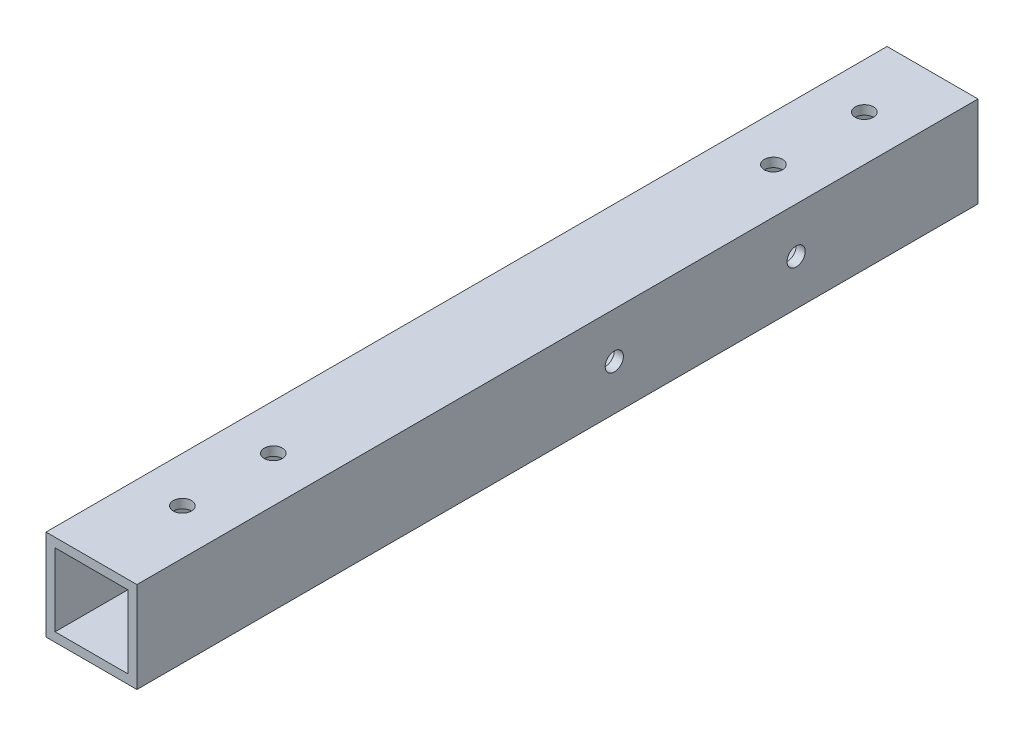
ISO-10303-21;
HEADER;
FILE_DESCRIPTION(('STEP AP214'),'2;1');
FILE_NAME('part.step','',(''),(''),'','','');
FILE_SCHEMA(('AUTOMOTIVE_DESIGN { 1 0 10303 214 1 1 1 1 }'));
ENDSEC;
DATA;
#1=APPLICATION_CONTEXT('core data for automotive mechanical design processes');
#2=APPLICATION_PROTOCOL_DEFINITION('international standard','automotive_design',2000,#1);
#3=PRODUCT_CONTEXT('',#1,'mechanical');
#4=PRODUCT('Part','Part','',(#3));
#5=PRODUCT_RELATED_PRODUCT_CATEGORY('part','',(#4));
#6=PRODUCT_DEFINITION_FORMATION('','',#4);
#7=PRODUCT_DEFINITION_CONTEXT('part definition',#1,'design');
#8=PRODUCT_DEFINITION('design','',#6,#7);
#9=PRODUCT_DEFINITION_SHAPE('','',#8);
#10=(LENGTH_UNIT() NAMED_UNIT(*) SI_UNIT(.MILLI.,.METRE.));
#11=(NAMED_UNIT(*) PLANE_ANGLE_UNIT() SI_UNIT($,.RADIAN.));
#12=(NAMED_UNIT(*) SI_UNIT($,.STERADIAN.) SOLID_ANGLE_UNIT());
#13=UNCERTAINTY_MEASURE_WITH_UNIT(LENGTH_MEASURE(1.E-05),#10,'distance_accuracy_value','');
#14=(GEOMETRIC_REPRESENTATION_CONTEXT(3) GLOBAL_UNCERTAINTY_ASSIGNED_CONTEXT((#13)) GLOBAL_UNIT_ASSIGNED_CONTEXT((#10,
#11,#12)) REPRESENTATION_CONTEXT('',''));
#15=CARTESIAN_POINT('',(0.,0.,0.));
#16=DIRECTION('',(0.,0.,1.));
#17=DIRECTION('',(1.,0.,0.));
#18=AXIS2_PLACEMENT_3D('',#15,#16,#17);
#19=CARTESIAN_POINT('',(0.,0.,185.));
#20=DIRECTION('',(0.,0.,-1.));
#21=DIRECTION('',(-1.,0.,0.));
#22=AXIS2_PLACEMENT_3D('',#19,#20,#21);
#23=PLANE('',#22);
#24=DIRECTION('',(0.,1.,0.));
#25=VECTOR('',#24,1.);
#26=CARTESIAN_POINT('',(10.,-10.,185.));
#27=LINE('',#26,#25);
#28=CARTESIAN_POINT('',(10.,-10.,185.));
#29=VERTEX_POINT('',#28);
#30=CARTESIAN_POINT('',(10.,10.,185.));
#31=VERTEX_POINT('',#30);
#32=EDGE_CURVE('E142',#29,#31,#27,.T.);
#33=ORIENTED_EDGE('',*,*,#32,.T.);
#34=DIRECTION('',(-1.,0.,0.));
#35=VECTOR('',#34,1.);
#36=CARTESIAN_POINT('',(-10.,10.,185.));
#37=LINE('',#36,#35);
#38=CARTESIAN_POINT('',(-10.,10.,185.));
#39=VERTEX_POINT('',#38);
#40=EDGE_CURVE('E145',#31,#39,#37,.T.);
#41=ORIENTED_EDGE('',*,*,#40,.T.);
#42=DIRECTION('',(0.,-1.,0.));
#43=VECTOR('',#42,1.);
#44=CARTESIAN_POINT('',(-10.,-10.,185.));
#45=LINE('',#44,#43);
#46=CARTESIAN_POINT('',(-10.,-10.,185.));
#47=VERTEX_POINT('',#46);
#48=EDGE_CURVE('E148',#39,#47,#45,.T.);
#49=ORIENTED_EDGE('',*,*,#48,.T.);
#50=DIRECTION('',(1.,0.,0.));
#51=VECTOR('',#50,1.);
#52=CARTESIAN_POINT('',(-10.,-10.,185.));
#53=LINE('',#52,#51);
#54=EDGE_CURVE('E150',#47,#29,#53,.T.);
#55=ORIENTED_EDGE('',*,*,#54,.T.);
#56=EDGE_LOOP('',(#33,#41,#49,#55));
#57=FACE_BOUND('',#56,.T.);
#58=DIRECTION('',(0.,1.,0.));
#59=VECTOR('',#58,1.);
#60=CARTESIAN_POINT('',(8.,7.99999999999999,185.));
#61=LINE('',#60,#59);
#62=CARTESIAN_POINT('',(8.,-8.00000000000001,185.));
#63=VERTEX_POINT('',#62);
#64=CARTESIAN_POINT('',(8.,7.99999999999999,185.));
#65=VERTEX_POINT('',#64);
#66=EDGE_CURVE('E104',#63,#65,#61,.T.);
#67=ORIENTED_EDGE('',*,*,#66,.F.);
#68=DIRECTION('',(1.,0.,0.));
#69=VECTOR('',#68,1.);
#70=CARTESIAN_POINT('',(-8.,-8.,185.));
#71=LINE('',#70,#69);
#72=CARTESIAN_POINT('',(-8.,-8.,185.));
#73=VERTEX_POINT('',#72);
#74=EDGE_CURVE('E126',#73,#63,#71,.T.);
#75=ORIENTED_EDGE('',*,*,#74,.F.);
#76=DIRECTION('',(0.,-1.,0.));
#77=VECTOR('',#76,1.);
#78=CARTESIAN_POINT('',(-8.,7.99999999999999,185.));
#79=LINE('',#78,#77);
#80=CARTESIAN_POINT('',(-8.,7.99999999999999,185.));
#81=VERTEX_POINT('',#80);
#82=EDGE_CURVE('E124',#81,#73,#79,.T.);
#83=ORIENTED_EDGE('',*,*,#82,.F.);
#84=DIRECTION('',(-1.,0.,0.));
#85=VECTOR('',#84,1.);
#86=CARTESIAN_POINT('',(-8.,7.99999999999999,185.));
#87=LINE('',#86,#85);
#88=EDGE_CURVE('E112',#65,#81,#87,.T.);
#89=ORIENTED_EDGE('',*,*,#88,.F.);
#90=EDGE_LOOP('',(#67,#75,#83,#89));
#91=FACE_BOUND('',#90,.T.);
#92=ADVANCED_FACE('F37',(#57,#91),#23,.F.);
#93=CARTESIAN_POINT('',(0.,0.,0.));
#94=DIRECTION('',(0.,0.,-1.));
#95=DIRECTION('',(-1.,0.,0.));
#96=AXIS2_PLACEMENT_3D('',#93,#94,#95);
#97=PLANE('',#96);
#98=DIRECTION('',(0.,1.,0.));
#99=VECTOR('',#98,1.);
#100=CARTESIAN_POINT('',(10.,-10.,0.));
#101=LINE('',#100,#99);
#102=CARTESIAN_POINT('',(10.,-10.,0.));
#103=VERTEX_POINT('',#102);
#104=CARTESIAN_POINT('',(10.,10.,0.));
#105=VERTEX_POINT('',#104);
#106=EDGE_CURVE('E120',#103,#105,#101,.T.);
#107=ORIENTED_EDGE('',*,*,#106,.F.);
#108=DIRECTION('',(1.,0.,0.));
#109=VECTOR('',#108,1.);
#110=CARTESIAN_POINT('',(-10.,-10.,0.));
#111=LINE('',#110,#109);
#112=CARTESIAN_POINT('',(-10.,-10.,0.));
#113=VERTEX_POINT('',#112);
#114=EDGE_CURVE('E146',#113,#103,#111,.T.);
#115=ORIENTED_EDGE('',*,*,#114,.F.);
#116=DIRECTION('',(0.,-1.,0.));
#117=VECTOR('',#116,1.);
#118=CARTESIAN_POINT('',(-10.,-10.,0.));
#119=LINE('',#118,#117);
#120=CARTESIAN_POINT('',(-10.,10.,0.));
#121=VERTEX_POINT('',#120);
#122=EDGE_CURVE('E157',#121,#113,#119,.T.);
#123=ORIENTED_EDGE('',*,*,#122,.F.);
#124=DIRECTION('',(-1.,0.,0.));
#125=VECTOR('',#124,1.);
#126=CARTESIAN_POINT('',(-10.,10.,0.));
#127=LINE('',#126,#125);
#128=EDGE_CURVE('E155',#105,#121,#127,.T.);
#129=ORIENTED_EDGE('',*,*,#128,.F.);
#130=EDGE_LOOP('',(#107,#115,#123,#129));
#131=FACE_BOUND('',#130,.T.);
#132=DIRECTION('',(1.,0.,0.));
#133=VECTOR('',#132,1.);
#134=CARTESIAN_POINT('',(-8.,-8.,0.));
#135=LINE('',#134,#133);
#136=CARTESIAN_POINT('',(-8.,-8.,0.));
#137=VERTEX_POINT('',#136);
#138=CARTESIAN_POINT('',(8.,-8.00000000000001,0.));
#139=VERTEX_POINT('',#138);
#140=EDGE_CURVE('E113',#137,#139,#135,.T.);
#141=ORIENTED_EDGE('',*,*,#140,.T.);
#142=DIRECTION('',(0.,1.,0.));
#143=VECTOR('',#142,1.);
#144=CARTESIAN_POINT('',(8.,7.99999999999999,0.));
#145=LINE('',#144,#143);
#146=CARTESIAN_POINT('',(8.,7.99999999999999,0.));
#147=VERTEX_POINT('',#146);
#148=EDGE_CURVE('E62',#139,#147,#145,.T.);
#149=ORIENTED_EDGE('',*,*,#148,.T.);
#150=DIRECTION('',(-1.,0.,0.));
#151=VECTOR('',#150,1.);
#152=CARTESIAN_POINT('',(-8.,7.99999999999999,0.));
#153=LINE('',#152,#151);
#154=CARTESIAN_POINT('',(-8.,7.99999999999999,0.));
#155=VERTEX_POINT('',#154);
#156=EDGE_CURVE('E119',#147,#155,#153,.T.);
#157=ORIENTED_EDGE('',*,*,#156,.T.);
#158=DIRECTION('',(0.,-1.,0.));
#159=VECTOR('',#158,1.);
#160=CARTESIAN_POINT('',(-8.,7.99999999999999,0.));
#161=LINE('',#160,#159);
#162=EDGE_CURVE('E134',#155,#137,#161,.T.);
#163=ORIENTED_EDGE('',*,*,#162,.T.);
#164=EDGE_LOOP('',(#141,#149,#157,#163));
#165=FACE_BOUND('',#164,.T.);
#166=ADVANCED_FACE('F274',(#131,#165),#97,.T.);
#167=CARTESIAN_POINT('',(10.,-10.,185.));
#168=DIRECTION('',(-1.,0.,0.));
#169=DIRECTION('',(0.,0.,1.));
#170=AXIS2_PLACEMENT_3D('',#167,#168,#169);
#171=PLANE('',#170);
#172=CARTESIAN_POINT('',(10.,0.,40.));
#173=DIRECTION('',(-1.,0.,0.));
#174=DIRECTION('',(0.,0.,1.));
#175=AXIS2_PLACEMENT_3D('',#172,#173,#174);
#176=CIRCLE('',#175,2.);
#177=CARTESIAN_POINT('',(10.,0.,42.));
#178=VERTEX_POINT('',#177);
#179=EDGE_CURVE('E185',#178,#178,#176,.T.);
#180=ORIENTED_EDGE('',*,*,#179,.T.);
#181=EDGE_LOOP('',(#180));
#182=FACE_BOUND('',#181,.T.);
#183=CARTESIAN_POINT('',(10.,0.,80.));
#184=DIRECTION('',(-1.,0.,0.));
#185=DIRECTION('',(0.,0.,1.));
#186=AXIS2_PLACEMENT_3D('',#183,#184,#185);
#187=CIRCLE('',#186,2.);
#188=CARTESIAN_POINT('',(10.,0.,82.));
#189=VERTEX_POINT('',#188);
#190=EDGE_CURVE('E201',#189,#189,#187,.T.);
#191=ORIENTED_EDGE('',*,*,#190,.T.);
#192=EDGE_LOOP('',(#191));
#193=FACE_BOUND('',#192,.T.);
#194=ORIENTED_EDGE('',*,*,#106,.T.);
#195=DIRECTION('',(0.,0.,-1.));
#196=VECTOR('',#195,1.);
#197=CARTESIAN_POINT('',(10.,10.,185.));
#198=LINE('',#197,#196);
#199=EDGE_CURVE('E11',#31,#105,#198,.T.);
#200=ORIENTED_EDGE('',*,*,#199,.F.);
#201=ORIENTED_EDGE('',*,*,#32,.F.);
#202=DIRECTION('',(0.,0.,-1.));
#203=VECTOR('',#202,1.);
#204=CARTESIAN_POINT('',(10.,-10.,185.));
#205=LINE('',#204,#203);
#206=EDGE_CURVE('E152',#29,#103,#205,.T.);
#207=ORIENTED_EDGE('',*,*,#206,.T.);
#208=EDGE_LOOP('',(#194,#200,#201,#207));
#209=FACE_BOUND('',#208,.T.);
#210=ADVANCED_FACE('F39',(#182,#193,#209),#171,.F.);
#211=CARTESIAN_POINT('',(-10.,10.,185.));
#212=DIRECTION('',(0.,-1.,0.));
#213=DIRECTION('',(1.,0.,0.));
#214=AXIS2_PLACEMENT_3D('',#211,#212,#213);
#215=PLANE('',#214);
#216=CARTESIAN_POINT('',(0.,10.,15.));
#217=DIRECTION('',(0.,1.,0.));
#218=DIRECTION('',(-1.,0.,0.));
#219=AXIS2_PLACEMENT_3D('',#216,#217,#218);
#220=CIRCLE('',#219,2.);
#221=CARTESIAN_POINT('',(-2.,10.,15.));
#222=VERTEX_POINT('',#221);
#223=EDGE_CURVE('E210',#222,#222,#220,.T.);
#224=ORIENTED_EDGE('',*,*,#223,.F.);
#225=EDGE_LOOP('',(#224));
#226=FACE_BOUND('',#225,.T.);
#227=CARTESIAN_POINT('',(0.,10.,145.));
#228=DIRECTION('',(0.,1.,0.));
#229=DIRECTION('',(-1.,0.,0.));
#230=AXIS2_PLACEMENT_3D('',#227,#228,#229);
#231=CIRCLE('',#230,2.);
#232=CARTESIAN_POINT('',(-2.00000000000001,10.,145.));
#233=VERTEX_POINT('',#232);
#234=EDGE_CURVE('E214',#233,#233,#231,.T.);
#235=ORIENTED_EDGE('',*,*,#234,.F.);
#236=EDGE_LOOP('',(#235));
#237=FACE_BOUND('',#236,.T.);
#238=CARTESIAN_POINT('',(0.,10.,165.));
#239=DIRECTION('',(0.,1.,0.));
#240=DIRECTION('',(-1.,0.,0.));
#241=AXIS2_PLACEMENT_3D('',#238,#239,#240);
#242=CIRCLE('',#241,2.);
#243=CARTESIAN_POINT('',(-2.,10.,165.));
#244=VERTEX_POINT('',#243);
#245=EDGE_CURVE('E225',#244,#244,#242,.T.);
#246=ORIENTED_EDGE('',*,*,#245,.F.);
#247=EDGE_LOOP('',(#246));
#248=FACE_BOUND('',#247,.T.);
#249=CARTESIAN_POINT('',(0.,10.,35.));
#250=DIRECTION('',(0.,1.,0.));
#251=DIRECTION('',(-1.,0.,0.));
#252=AXIS2_PLACEMENT_3D('',#249,#250,#251);
#253=CIRCLE('',#252,2.);
#254=CARTESIAN_POINT('',(-2.,10.,35.));
#255=VERTEX_POINT('',#254);
#256=EDGE_CURVE('E213',#255,#255,#253,.T.);
#257=ORIENTED_EDGE('',*,*,#256,.F.);
#258=EDGE_LOOP('',(#257));
#259=FACE_BOUND('',#258,.T.);
#260=ORIENTED_EDGE('',*,*,#128,.T.);
#261=DIRECTION('',(0.,0.,-1.));
#262=VECTOR('',#261,1.);
#263=CARTESIAN_POINT('',(-10.,10.,185.));
#264=LINE('',#263,#262);
#265=EDGE_CURVE('E46',#39,#121,#264,.T.);
#266=ORIENTED_EDGE('',*,*,#265,.F.);
#267=ORIENTED_EDGE('',*,*,#40,.F.);
#268=ORIENTED_EDGE('',*,*,#199,.T.);
#269=EDGE_LOOP('',(#260,#266,#267,#268));
#270=FACE_BOUND('',#269,.T.);
#271=ADVANCED_FACE('F260',(#226,#237,#248,#259,#270),#215,.F.);
#272=CARTESIAN_POINT('',(-10.,-10.,185.));
#273=DIRECTION('',(1.,0.,0.));
#274=DIRECTION('',(0.,0.,-1.));
#275=AXIS2_PLACEMENT_3D('',#272,#273,#274);
#276=PLANE('',#275);
#277=CARTESIAN_POINT('',(-10.,0.,40.));
#278=DIRECTION('',(-1.,0.,0.));
#279=DIRECTION('',(0.,0.,1.));
#280=AXIS2_PLACEMENT_3D('',#277,#278,#279);
#281=CIRCLE('',#280,2.);
#282=CARTESIAN_POINT('',(-10.,0.,42.));
#283=VERTEX_POINT('',#282);
#284=EDGE_CURVE('E191',#283,#283,#281,.T.);
#285=ORIENTED_EDGE('',*,*,#284,.F.);
#286=EDGE_LOOP('',(#285));
#287=FACE_BOUND('',#286,.T.);
#288=CARTESIAN_POINT('',(-10.,0.,80.));
#289=DIRECTION('',(-1.,0.,0.));
#290=DIRECTION('',(0.,0.,1.));
#291=AXIS2_PLACEMENT_3D('',#288,#289,#290);
#292=CIRCLE('',#291,2.);
#293=CARTESIAN_POINT('',(-10.,0.,82.));
#294=VERTEX_POINT('',#293);
#295=EDGE_CURVE('E196',#294,#294,#292,.T.);
#296=ORIENTED_EDGE('',*,*,#295,.F.);
#297=EDGE_LOOP('',(#296));
#298=FACE_BOUND('',#297,.T.);
#299=ORIENTED_EDGE('',*,*,#122,.T.);
#300=DIRECTION('',(0.,0.,-1.));
#301=VECTOR('',#300,1.);
#302=CARTESIAN_POINT('',(-10.,-10.,185.));
#303=LINE('',#302,#301);
#304=EDGE_CURVE('E162',#47,#113,#303,.T.);
#305=ORIENTED_EDGE('',*,*,#304,.F.);
#306=ORIENTED_EDGE('',*,*,#48,.F.);
#307=ORIENTED_EDGE('',*,*,#265,.T.);
#308=EDGE_LOOP('',(#299,#305,#306,#307));
#309=FACE_BOUND('',#308,.T.);
#310=ADVANCED_FACE('F263',(#287,#298,#309),#276,.F.);
#311=CARTESIAN_POINT('',(-10.,-10.,185.));
#312=DIRECTION('',(0.,1.,0.));
#313=DIRECTION('',(-1.,0.,0.));
#314=AXIS2_PLACEMENT_3D('',#311,#312,#313);
#315=PLANE('',#314);
#316=CARTESIAN_POINT('',(0.,-10.,15.));
#317=DIRECTION('',(0.,1.,0.));
#318=DIRECTION('',(-1.,0.,0.));
#319=AXIS2_PLACEMENT_3D('',#316,#317,#318);
#320=CIRCLE('',#319,2.);
#321=CARTESIAN_POINT('',(-2.,-10.,15.));
#322=VERTEX_POINT('',#321);
#323=EDGE_CURVE('E171',#322,#322,#320,.T.);
#324=ORIENTED_EDGE('',*,*,#323,.T.);
#325=EDGE_LOOP('',(#324));
#326=FACE_BOUND('',#325,.T.);
#327=CARTESIAN_POINT('',(0.,-10.,145.));
#328=DIRECTION('',(0.,1.,0.));
#329=DIRECTION('',(-1.,0.,0.));
#330=AXIS2_PLACEMENT_3D('',#327,#328,#329);
#331=CIRCLE('',#330,2.);
#332=CARTESIAN_POINT('',(-2.,-10.,145.));
#333=VERTEX_POINT('',#332);
#334=EDGE_CURVE('E207',#333,#333,#331,.T.);
#335=ORIENTED_EDGE('',*,*,#334,.T.);
#336=EDGE_LOOP('',(#335));
#337=FACE_BOUND('',#336,.T.);
#338=CARTESIAN_POINT('',(0.,-10.,165.));
#339=DIRECTION('',(0.,1.,0.));
#340=DIRECTION('',(-1.,0.,0.));
#341=AXIS2_PLACEMENT_3D('',#338,#339,#340);
#342=CIRCLE('',#341,2.);
#343=CARTESIAN_POINT('',(-2.,-10.,165.));
#344=VERTEX_POINT('',#343);
#345=EDGE_CURVE('E217',#344,#344,#342,.T.);
#346=ORIENTED_EDGE('',*,*,#345,.T.);
#347=EDGE_LOOP('',(#346));
#348=FACE_BOUND('',#347,.T.);
#349=CARTESIAN_POINT('',(0.,-10.,35.));
#350=DIRECTION('',(0.,1.,0.));
#351=DIRECTION('',(-1.,0.,0.));
#352=AXIS2_PLACEMENT_3D('',#349,#350,#351);
#353=CIRCLE('',#352,2.);
#354=CARTESIAN_POINT('',(-2.,-10.,35.));
#355=VERTEX_POINT('',#354);
#356=EDGE_CURVE('E222',#355,#355,#353,.T.);
#357=ORIENTED_EDGE('',*,*,#356,.T.);
#358=EDGE_LOOP('',(#357));
#359=FACE_BOUND('',#358,.T.);
#360=ORIENTED_EDGE('',*,*,#114,.T.);
#361=ORIENTED_EDGE('',*,*,#206,.F.);
#362=ORIENTED_EDGE('',*,*,#54,.F.);
#363=ORIENTED_EDGE('',*,*,#304,.T.);
#364=EDGE_LOOP('',(#360,#361,#362,#363));
#365=FACE_BOUND('',#364,.T.);
#366=ADVANCED_FACE('F278',(#326,#337,#348,#359,#365),#315,.F.);
#367=CARTESIAN_POINT('',(8.,7.99999999999999,185.));
#368=DIRECTION('',(-1.,0.,0.));
#369=DIRECTION('',(0.,0.,1.));
#370=AXIS2_PLACEMENT_3D('',#367,#368,#369);
#371=PLANE('',#370);
#372=CARTESIAN_POINT('',(8.,0.,40.));
#373=DIRECTION('',(-1.,0.,0.));
#374=DIRECTION('',(0.,0.,1.));
#375=AXIS2_PLACEMENT_3D('',#372,#373,#374);
#376=CIRCLE('',#375,2.);
#377=CARTESIAN_POINT('',(8.,0.,42.));
#378=VERTEX_POINT('',#377);
#379=EDGE_CURVE('E204',#378,#378,#376,.T.);
#380=ORIENTED_EDGE('',*,*,#379,.F.);
#381=EDGE_LOOP('',(#380));
#382=FACE_BOUND('',#381,.T.);
#383=CARTESIAN_POINT('',(8.,0.,80.));
#384=DIRECTION('',(-1.,0.,0.));
#385=DIRECTION('',(0.,0.,1.));
#386=AXIS2_PLACEMENT_3D('',#383,#384,#385);
#387=CIRCLE('',#386,2.);
#388=CARTESIAN_POINT('',(8.,0.,82.));
#389=VERTEX_POINT('',#388);
#390=EDGE_CURVE('E184',#389,#389,#387,.T.);
#391=ORIENTED_EDGE('',*,*,#390,.F.);
#392=EDGE_LOOP('',(#391));
#393=FACE_BOUND('',#392,.T.);
#394=ORIENTED_EDGE('',*,*,#148,.F.);
#395=DIRECTION('',(0.,0.,-1.));
#396=VECTOR('',#395,1.);
#397=CARTESIAN_POINT('',(8.,-8.00000000000001,185.));
#398=LINE('',#397,#396);
#399=EDGE_CURVE('E108',#63,#139,#398,.T.);
#400=ORIENTED_EDGE('',*,*,#399,.F.);
#401=ORIENTED_EDGE('',*,*,#66,.T.);
#402=DIRECTION('',(0.,0.,-1.));
#403=VECTOR('',#402,1.);
#404=CARTESIAN_POINT('',(8.,7.99999999999999,185.));
#405=LINE('',#404,#403);
#406=EDGE_CURVE('E107',#65,#147,#405,.T.);
#407=ORIENTED_EDGE('',*,*,#406,.T.);
#408=EDGE_LOOP('',(#394,#400,#401,#407));
#409=FACE_BOUND('',#408,.T.);
#410=ADVANCED_FACE('F106',(#382,#393,#409),#371,.T.);
#411=CARTESIAN_POINT('',(-8.,7.99999999999999,185.));
#412=DIRECTION('',(0.,-1.,0.));
#413=DIRECTION('',(0.,0.,-1.));
#414=AXIS2_PLACEMENT_3D('',#411,#412,#413);
#415=PLANE('',#414);
#416=CARTESIAN_POINT('',(0.,8.,15.));
#417=DIRECTION('',(0.,-1.,0.));
#418=DIRECTION('',(0.,0.,-1.));
#419=AXIS2_PLACEMENT_3D('',#416,#417,#418);
#420=CIRCLE('',#419,2.);
#421=CARTESIAN_POINT('',(0.,8.,13.));
#422=VERTEX_POINT('',#421);
#423=EDGE_CURVE('E132',#422,#422,#420,.T.);
#424=ORIENTED_EDGE('',*,*,#423,.F.);
#425=EDGE_LOOP('',(#424));
#426=FACE_BOUND('',#425,.T.);
#427=CARTESIAN_POINT('',(0.,8.,145.));
#428=DIRECTION('',(0.,-1.,0.));
#429=DIRECTION('',(0.,0.,-1.));
#430=AXIS2_PLACEMENT_3D('',#427,#428,#429);
#431=CIRCLE('',#430,2.);
#432=CARTESIAN_POINT('',(0.,8.,143.));
#433=VERTEX_POINT('',#432);
#434=EDGE_CURVE('E179',#433,#433,#431,.T.);
#435=ORIENTED_EDGE('',*,*,#434,.F.);
#436=EDGE_LOOP('',(#435));
#437=FACE_BOUND('',#436,.T.);
#438=CARTESIAN_POINT('',(0.,8.,165.));
#439=DIRECTION('',(0.,-1.,0.));
#440=DIRECTION('',(0.,0.,-1.));
#441=AXIS2_PLACEMENT_3D('',#438,#439,#440);
#442=CIRCLE('',#441,2.);
#443=CARTESIAN_POINT('',(0.,8.,163.));
#444=VERTEX_POINT('',#443);
#445=EDGE_CURVE('E175',#444,#444,#442,.T.);
#446=ORIENTED_EDGE('',*,*,#445,.F.);
#447=EDGE_LOOP('',(#446));
#448=FACE_BOUND('',#447,.T.);
#449=CARTESIAN_POINT('',(0.,8.,35.));
#450=DIRECTION('',(0.,-1.,0.));
#451=DIRECTION('',(0.,0.,-1.));
#452=AXIS2_PLACEMENT_3D('',#449,#450,#451);
#453=CIRCLE('',#452,2.);
#454=CARTESIAN_POINT('',(0.,8.,33.));
#455=VERTEX_POINT('',#454);
#456=EDGE_CURVE('E170',#455,#455,#453,.T.);
#457=ORIENTED_EDGE('',*,*,#456,.F.);
#458=EDGE_LOOP('',(#457));
#459=FACE_BOUND('',#458,.T.);
#460=ORIENTED_EDGE('',*,*,#156,.F.);
#461=ORIENTED_EDGE('',*,*,#406,.F.);
#462=ORIENTED_EDGE('',*,*,#88,.T.);
#463=DIRECTION('',(0.,0.,-1.));
#464=VECTOR('',#463,1.);
#465=CARTESIAN_POINT('',(-8.,7.99999999999999,185.));
#466=LINE('',#465,#464);
#467=EDGE_CURVE('E121',#81,#155,#466,.T.);
#468=ORIENTED_EDGE('',*,*,#467,.T.);
#469=EDGE_LOOP('',(#460,#461,#462,#468));
#470=FACE_BOUND('',#469,.T.);
#471=ADVANCED_FACE('F116',(#426,#437,#448,#459,#470),#415,.T.);
#472=CARTESIAN_POINT('',(-8.,7.99999999999999,185.));
#473=DIRECTION('',(1.,0.,0.));
#474=DIRECTION('',(0.,0.,-1.));
#475=AXIS2_PLACEMENT_3D('',#472,#473,#474);
#476=PLANE('',#475);
#477=CARTESIAN_POINT('',(-8.,0.,40.));
#478=DIRECTION('',(1.,0.,0.));
#479=DIRECTION('',(0.,0.,-1.));
#480=AXIS2_PLACEMENT_3D('',#477,#478,#479);
#481=CIRCLE('',#480,2.);
#482=CARTESIAN_POINT('',(-8.,0.,38.));
#483=VERTEX_POINT('',#482);
#484=EDGE_CURVE('E41',#483,#483,#481,.T.);
#485=ORIENTED_EDGE('',*,*,#484,.F.);
#486=EDGE_LOOP('',(#485));
#487=FACE_BOUND('',#486,.T.);
#488=CARTESIAN_POINT('',(-8.,0.,80.));
#489=DIRECTION('',(1.,0.,0.));
#490=DIRECTION('',(0.,0.,-1.));
#491=AXIS2_PLACEMENT_3D('',#488,#489,#490);
#492=CIRCLE('',#491,2.);
#493=CARTESIAN_POINT('',(-8.,0.,78.));
#494=VERTEX_POINT('',#493);
#495=EDGE_CURVE('E182',#494,#494,#492,.T.);
#496=ORIENTED_EDGE('',*,*,#495,.F.);
#497=EDGE_LOOP('',(#496));
#498=FACE_BOUND('',#497,.T.);
#499=ORIENTED_EDGE('',*,*,#162,.F.);
#500=ORIENTED_EDGE('',*,*,#467,.F.);
#501=ORIENTED_EDGE('',*,*,#82,.T.);
#502=DIRECTION('',(0.,0.,-1.));
#503=VECTOR('',#502,1.);
#504=CARTESIAN_POINT('',(-8.,-8.,185.));
#505=LINE('',#504,#503);
#506=EDGE_CURVE('E54',#73,#137,#505,.T.);
#507=ORIENTED_EDGE('',*,*,#506,.T.);
#508=EDGE_LOOP('',(#499,#500,#501,#507));
#509=FACE_BOUND('',#508,.T.);
#510=ADVANCED_FACE('F243',(#487,#498,#509),#476,.T.);
#511=CARTESIAN_POINT('',(-8.,-8.,185.));
#512=DIRECTION('',(0.,1.,0.));
#513=DIRECTION('',(-1.,0.,0.));
#514=AXIS2_PLACEMENT_3D('',#511,#512,#513);
#515=PLANE('',#514);
#516=CARTESIAN_POINT('',(0.,-8.,15.));
#517=DIRECTION('',(0.,1.,0.));
#518=DIRECTION('',(-1.,0.,0.));
#519=AXIS2_PLACEMENT_3D('',#516,#517,#518);
#520=CIRCLE('',#519,2.);
#521=CARTESIAN_POINT('',(-2.,-8.,15.));
#522=VERTEX_POINT('',#521);
#523=EDGE_CURVE('E180',#522,#522,#520,.T.);
#524=ORIENTED_EDGE('',*,*,#523,.F.);
#525=EDGE_LOOP('',(#524));
#526=FACE_BOUND('',#525,.T.);
#527=CARTESIAN_POINT('',(0.,-8.,145.));
#528=DIRECTION('',(0.,1.,0.));
#529=DIRECTION('',(-1.,0.,0.));
#530=AXIS2_PLACEMENT_3D('',#527,#528,#529);
#531=CIRCLE('',#530,2.);
#532=CARTESIAN_POINT('',(-2.,-8.,145.));
#533=VERTEX_POINT('',#532);
#534=EDGE_CURVE('E176',#533,#533,#531,.T.);
#535=ORIENTED_EDGE('',*,*,#534,.F.);
#536=EDGE_LOOP('',(#535));
#537=FACE_BOUND('',#536,.T.);
#538=CARTESIAN_POINT('',(0.,-8.,165.));
#539=DIRECTION('',(0.,1.,0.));
#540=DIRECTION('',(-1.,0.,0.));
#541=AXIS2_PLACEMENT_3D('',#538,#539,#540);
#542=CIRCLE('',#541,2.);
#543=CARTESIAN_POINT('',(-2.,-8.,165.));
#544=VERTEX_POINT('',#543);
#545=EDGE_CURVE('E172',#544,#544,#542,.T.);
#546=ORIENTED_EDGE('',*,*,#545,.F.);
#547=EDGE_LOOP('',(#546));
#548=FACE_BOUND('',#547,.T.);
#549=CARTESIAN_POINT('',(0.,-8.,35.));
#550=DIRECTION('',(0.,1.,0.));
#551=DIRECTION('',(-1.,0.,0.));
#552=AXIS2_PLACEMENT_3D('',#549,#550,#551);
#553=CIRCLE('',#552,2.);
#554=CARTESIAN_POINT('',(-2.,-8.,35.));
#555=VERTEX_POINT('',#554);
#556=EDGE_CURVE('E167',#555,#555,#553,.T.);
#557=ORIENTED_EDGE('',*,*,#556,.F.);
#558=EDGE_LOOP('',(#557));
#559=FACE_BOUND('',#558,.T.);
#560=ORIENTED_EDGE('',*,*,#140,.F.);
#561=ORIENTED_EDGE('',*,*,#506,.F.);
#562=ORIENTED_EDGE('',*,*,#74,.T.);
#563=ORIENTED_EDGE('',*,*,#399,.T.);
#564=EDGE_LOOP('',(#560,#561,#562,#563));
#565=FACE_BOUND('',#564,.T.);
#566=ADVANCED_FACE('F363',(#526,#537,#548,#559,#565),#515,.T.);
#567=CARTESIAN_POINT('',(0.,-10.,35.));
#568=DIRECTION('',(0.,1.,0.));
#569=DIRECTION('',(-1.,0.,0.));
#570=AXIS2_PLACEMENT_3D('',#567,#568,#569);
#571=CYLINDRICAL_SURFACE('',#570,2.);
#572=ORIENTED_EDGE('',*,*,#556,.T.);
#573=EDGE_LOOP('',(#572));
#574=FACE_BOUND('',#573,.T.);
#575=ORIENTED_EDGE('',*,*,#356,.F.);
#576=EDGE_LOOP('',(#575));
#577=FACE_BOUND('',#576,.T.);
#578=ADVANCED_FACE('F257',(#574,#577),#571,.F.);
#579=CARTESIAN_POINT('',(0.,-10.,165.));
#580=DIRECTION('',(0.,1.,0.));
#581=DIRECTION('',(-1.,0.,0.));
#582=AXIS2_PLACEMENT_3D('',#579,#580,#581);
#583=CYLINDRICAL_SURFACE('',#582,2.);
#584=ORIENTED_EDGE('',*,*,#545,.T.);
#585=EDGE_LOOP('',(#584));
#586=FACE_BOUND('',#585,.T.);
#587=ORIENTED_EDGE('',*,*,#345,.F.);
#588=EDGE_LOOP('',(#587));
#589=FACE_BOUND('',#588,.T.);
#590=ADVANCED_FACE('F378',(#586,#589),#583,.F.);
#591=CARTESIAN_POINT('',(0.,-10.,145.));
#592=DIRECTION('',(0.,1.,0.));
#593=DIRECTION('',(-1.,0.,0.));
#594=AXIS2_PLACEMENT_3D('',#591,#592,#593);
#595=CYLINDRICAL_SURFACE('',#594,2.);
#596=ORIENTED_EDGE('',*,*,#534,.T.);
#597=EDGE_LOOP('',(#596));
#598=FACE_BOUND('',#597,.T.);
#599=ORIENTED_EDGE('',*,*,#334,.F.);
#600=EDGE_LOOP('',(#599));
#601=FACE_BOUND('',#600,.T.);
#602=ADVANCED_FACE('F388',(#598,#601),#595,.F.);
#603=CARTESIAN_POINT('',(0.,-10.,15.));
#604=DIRECTION('',(0.,1.,0.));
#605=DIRECTION('',(-1.,0.,0.));
#606=AXIS2_PLACEMENT_3D('',#603,#604,#605);
#607=CYLINDRICAL_SURFACE('',#606,2.);
#608=ORIENTED_EDGE('',*,*,#523,.T.);
#609=EDGE_LOOP('',(#608));
#610=FACE_BOUND('',#609,.T.);
#611=ORIENTED_EDGE('',*,*,#323,.F.);
#612=EDGE_LOOP('',(#611));
#613=FACE_BOUND('',#612,.T.);
#614=ADVANCED_FACE('F255',(#610,#613),#607,.F.);
#615=ORIENTED_EDGE('',*,*,#456,.T.);
#616=EDGE_LOOP('',(#615));
#617=FACE_BOUND('',#616,.T.);
#618=ORIENTED_EDGE('',*,*,#256,.T.);
#619=EDGE_LOOP('',(#618));
#620=FACE_BOUND('',#619,.T.);
#621=ADVANCED_FACE('F251',(#617,#620),#571,.F.);
#622=ORIENTED_EDGE('',*,*,#445,.T.);
#623=EDGE_LOOP('',(#622));
#624=FACE_BOUND('',#623,.T.);
#625=ORIENTED_EDGE('',*,*,#245,.T.);
#626=EDGE_LOOP('',(#625));
#627=FACE_BOUND('',#626,.T.);
#628=ADVANCED_FACE('F254',(#624,#627),#583,.F.);
#629=ORIENTED_EDGE('',*,*,#434,.T.);
#630=EDGE_LOOP('',(#629));
#631=FACE_BOUND('',#630,.T.);
#632=ORIENTED_EDGE('',*,*,#234,.T.);
#633=EDGE_LOOP('',(#632));
#634=FACE_BOUND('',#633,.T.);
#635=ADVANCED_FACE('F314',(#631,#634),#595,.F.);
#636=ORIENTED_EDGE('',*,*,#423,.T.);
#637=EDGE_LOOP('',(#636));
#638=FACE_BOUND('',#637,.T.);
#639=ORIENTED_EDGE('',*,*,#223,.T.);
#640=EDGE_LOOP('',(#639));
#641=FACE_BOUND('',#640,.T.);
#642=ADVANCED_FACE('F238',(#638,#641),#607,.F.);
#643=CARTESIAN_POINT('',(10.,0.,80.));
#644=DIRECTION('',(-1.,0.,0.));
#645=DIRECTION('',(0.,0.,1.));
#646=AXIS2_PLACEMENT_3D('',#643,#644,#645);
#647=CYLINDRICAL_SURFACE('',#646,2.);
#648=ORIENTED_EDGE('',*,*,#495,.T.);
#649=EDGE_LOOP('',(#648));
#650=FACE_BOUND('',#649,.T.);
#651=ORIENTED_EDGE('',*,*,#295,.T.);
#652=EDGE_LOOP('',(#651));
#653=FACE_BOUND('',#652,.T.);
#654=ADVANCED_FACE('F302',(#650,#653),#647,.F.);
#655=CARTESIAN_POINT('',(10.,0.,40.));
#656=DIRECTION('',(-1.,0.,0.));
#657=DIRECTION('',(0.,0.,1.));
#658=AXIS2_PLACEMENT_3D('',#655,#656,#657);
#659=CYLINDRICAL_SURFACE('',#658,2.);
#660=ORIENTED_EDGE('',*,*,#484,.T.);
#661=EDGE_LOOP('',(#660));
#662=FACE_BOUND('',#661,.T.);
#663=ORIENTED_EDGE('',*,*,#284,.T.);
#664=EDGE_LOOP('',(#663));
#665=FACE_BOUND('',#664,.T.);
#666=ADVANCED_FACE('F304',(#662,#665),#659,.F.);
#667=ORIENTED_EDGE('',*,*,#390,.T.);
#668=EDGE_LOOP('',(#667));
#669=FACE_BOUND('',#668,.T.);
#670=ORIENTED_EDGE('',*,*,#190,.F.);
#671=EDGE_LOOP('',(#670));
#672=FACE_BOUND('',#671,.T.);
#673=ADVANCED_FACE('F306',(#669,#672),#647,.F.);
#674=ORIENTED_EDGE('',*,*,#379,.T.);
#675=EDGE_LOOP('',(#674));
#676=FACE_BOUND('',#675,.T.);
#677=ORIENTED_EDGE('',*,*,#179,.F.);
#678=EDGE_LOOP('',(#677));
#679=FACE_BOUND('',#678,.T.);
#680=ADVANCED_FACE('F313',(#676,#679),#659,.F.);
#681=CLOSED_SHELL('',(#92,#166,#210,#271,#310,#366,#410,#471,#510,#566,#578,#590,#602,#614,#621,
#628,#635,#642,#654,#666,#673,#680));
#682=MANIFOLD_SOLID_BREP('B2',#681);
#683=ADVANCED_BREP_SHAPE_REPRESENTATION('',(#18,#682),#14);
#684=SHAPE_DEFINITION_REPRESENTATION(#9,#683);
ENDSEC;
END-ISO-10303-21;
